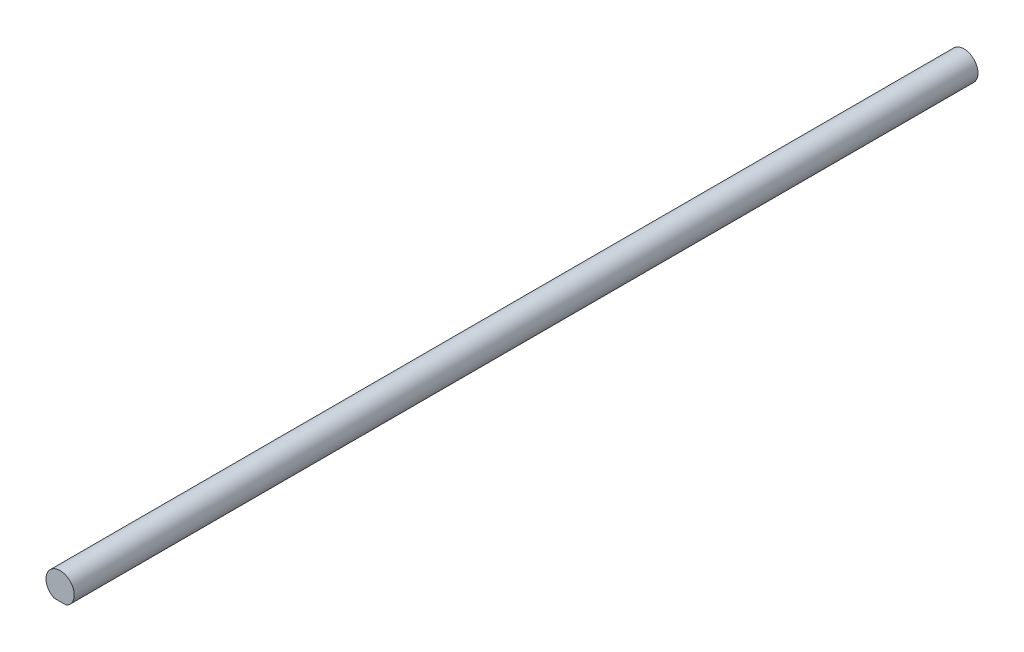
ISO-10303-21;
HEADER;
FILE_DESCRIPTION(('STEP AP214'),'2;1');
FILE_NAME('part.step','',(''),(''),'','','');
FILE_SCHEMA(('AUTOMOTIVE_DESIGN { 1 0 10303 214 1 1 1 1 }'));
ENDSEC;
DATA;
#1=APPLICATION_CONTEXT('core data for automotive mechanical design processes');
#2=APPLICATION_PROTOCOL_DEFINITION('international standard','automotive_design',2000,#1);
#3=PRODUCT_CONTEXT('',#1,'mechanical');
#4=PRODUCT('Part','Part','',(#3));
#5=PRODUCT_RELATED_PRODUCT_CATEGORY('part','',(#4));
#6=PRODUCT_DEFINITION_FORMATION('','',#4);
#7=PRODUCT_DEFINITION_CONTEXT('part definition',#1,'design');
#8=PRODUCT_DEFINITION('design','',#6,#7);
#9=PRODUCT_DEFINITION_SHAPE('','',#8);
#10=(LENGTH_UNIT() NAMED_UNIT(*) SI_UNIT(.MILLI.,.METRE.));
#11=(NAMED_UNIT(*) PLANE_ANGLE_UNIT() SI_UNIT($,.RADIAN.));
#12=(NAMED_UNIT(*) SI_UNIT($,.STERADIAN.) SOLID_ANGLE_UNIT());
#13=UNCERTAINTY_MEASURE_WITH_UNIT(LENGTH_MEASURE(1.E-05),#10,'distance_accuracy_value','');
#14=(GEOMETRIC_REPRESENTATION_CONTEXT(3) GLOBAL_UNCERTAINTY_ASSIGNED_CONTEXT((#13)) GLOBAL_UNIT_ASSIGNED_CONTEXT((#10,
#11,#12)) REPRESENTATION_CONTEXT('',''));
#15=CARTESIAN_POINT('',(0.,0.,0.));
#16=DIRECTION('',(0.,0.,1.));
#17=DIRECTION('',(1.,0.,0.));
#18=AXIS2_PLACEMENT_3D('',#15,#16,#17);
#19=CARTESIAN_POINT('',(0.,0.,203.2));
#20=DIRECTION('',(0.,0.,-1.));
#21=DIRECTION('',(-1.,0.,0.));
#22=AXIS2_PLACEMENT_3D('',#19,#20,#21);
#23=CYLINDRICAL_SURFACE('',#22,3.175);
#24=CARTESIAN_POINT('',(0.,0.,0.));
#25=DIRECTION('',(0.,0.,1.));
#26=DIRECTION('',(1.,0.,0.));
#27=AXIS2_PLACEMENT_3D('',#24,#25,#26);
#28=CIRCLE('',#27,3.175);
#29=CARTESIAN_POINT('',(1.38395041457416,-2.8575,0.));
#30=VERTEX_POINT('',#29);
#31=CARTESIAN_POINT('',(-1.38395041457416,-2.8575,0.));
#32=VERTEX_POINT('',#31);
#33=EDGE_CURVE('E68',#30,#32,#28,.T.);
#34=ORIENTED_EDGE('',*,*,#33,.T.);
#35=DIRECTION('',(0.,0.,-1.));
#36=VECTOR('',#35,1.);
#37=CARTESIAN_POINT('',(-1.38395041457416,-2.8575,203.2));
#38=LINE('',#37,#36);
#39=CARTESIAN_POINT('',(-1.38395041457416,-2.8575,203.2));
#40=VERTEX_POINT('',#39);
#41=EDGE_CURVE('E11',#40,#32,#38,.T.);
#42=ORIENTED_EDGE('',*,*,#41,.F.);
#43=CARTESIAN_POINT('',(0.,0.,203.2));
#44=DIRECTION('',(0.,0.,1.));
#45=DIRECTION('',(1.,0.,0.));
#46=AXIS2_PLACEMENT_3D('',#43,#44,#45);
#47=CIRCLE('',#46,3.175);
#48=CARTESIAN_POINT('',(1.38395041457416,-2.8575,203.2));
#49=VERTEX_POINT('',#48);
#50=EDGE_CURVE('E67',#49,#40,#47,.T.);
#51=ORIENTED_EDGE('',*,*,#50,.F.);
#52=DIRECTION('',(0.,0.,-1.));
#53=VECTOR('',#52,1.);
#54=CARTESIAN_POINT('',(1.38395041457416,-2.8575,203.2));
#55=LINE('',#54,#53);
#56=EDGE_CURVE('E45',#49,#30,#55,.T.);
#57=ORIENTED_EDGE('',*,*,#56,.T.);
#58=EDGE_LOOP('',(#34,#42,#51,#57));
#59=FACE_BOUND('',#58,.T.);
#60=ADVANCED_FACE('F37',(#59),#23,.T.);
#61=CARTESIAN_POINT('',(-1.38395041457416,-2.8575,203.2));
#62=DIRECTION('',(0.,1.,0.));
#63=DIRECTION('',(0.,0.,1.));
#64=AXIS2_PLACEMENT_3D('',#61,#62,#63);
#65=PLANE('',#64);
#66=DIRECTION('',(1.,0.,0.));
#67=VECTOR('',#66,1.);
#68=CARTESIAN_POINT('',(-1.38395041457416,-2.8575,0.));
#69=LINE('',#68,#67);
#70=EDGE_CURVE('E60',#32,#30,#69,.T.);
#71=ORIENTED_EDGE('',*,*,#70,.T.);
#72=ORIENTED_EDGE('',*,*,#56,.F.);
#73=DIRECTION('',(1.,0.,0.));
#74=VECTOR('',#73,1.);
#75=CARTESIAN_POINT('',(-1.38395041457416,-2.8575,203.2));
#76=LINE('',#75,#74);
#77=EDGE_CURVE('E52',#40,#49,#76,.T.);
#78=ORIENTED_EDGE('',*,*,#77,.F.);
#79=ORIENTED_EDGE('',*,*,#41,.T.);
#80=EDGE_LOOP('',(#71,#72,#78,#79));
#81=FACE_BOUND('',#80,.T.);
#82=ADVANCED_FACE('F63',(#81),#65,.F.);
#83=CARTESIAN_POINT('',(0.,0.,203.2));
#84=DIRECTION('',(0.,0.,1.));
#85=DIRECTION('',(1.,0.,0.));
#86=AXIS2_PLACEMENT_3D('',#83,#84,#85);
#87=PLANE('',#86);
#88=ORIENTED_EDGE('',*,*,#50,.T.);
#89=ORIENTED_EDGE('',*,*,#77,.T.);
#90=EDGE_LOOP('',(#88,#89));
#91=FACE_BOUND('',#90,.T.);
#92=ADVANCED_FACE('F75',(#91),#87,.T.);
#93=CARTESIAN_POINT('',(0.,0.,0.));
#94=DIRECTION('',(0.,0.,1.));
#95=DIRECTION('',(1.,0.,0.));
#96=AXIS2_PLACEMENT_3D('',#93,#94,#95);
#97=PLANE('',#96);
#98=ORIENTED_EDGE('',*,*,#33,.F.);
#99=ORIENTED_EDGE('',*,*,#70,.F.);
#100=EDGE_LOOP('',(#98,#99));
#101=FACE_BOUND('',#100,.T.);
#102=ADVANCED_FACE('F71',(#101),#97,.F.);
#103=CLOSED_SHELL('',(#60,#82,#92,#102));
#104=MANIFOLD_SOLID_BREP('B2',#103);
#105=ADVANCED_BREP_SHAPE_REPRESENTATION('',(#18,#104),#14);
#106=SHAPE_DEFINITION_REPRESENTATION(#9,#105);
ENDSEC;
END-ISO-10303-21;
